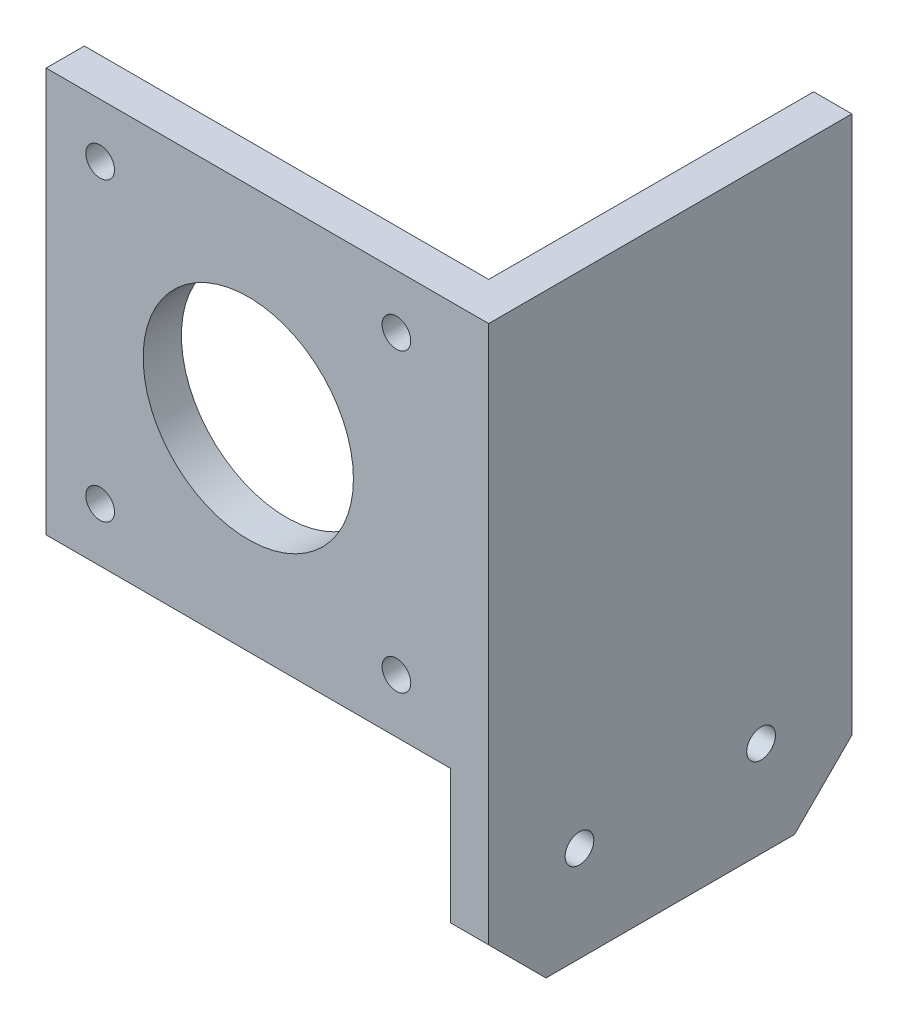
ISO-10303-21;
HEADER;
FILE_DESCRIPTION(('STEP AP214'),'2;1');
FILE_NAME('part.step','',(''),(''),'','','');
FILE_SCHEMA(('AUTOMOTIVE_DESIGN { 1 0 10303 214 1 1 1 1 }'));
ENDSEC;
DATA;
#1=APPLICATION_CONTEXT('core data for automotive mechanical design processes');
#2=APPLICATION_PROTOCOL_DEFINITION('international standard','automotive_design',2000,#1);
#3=PRODUCT_CONTEXT('',#1,'mechanical');
#4=PRODUCT('Part','Part','',(#3));
#5=PRODUCT_RELATED_PRODUCT_CATEGORY('part','',(#4));
#6=PRODUCT_DEFINITION_FORMATION('','',#4);
#7=PRODUCT_DEFINITION_CONTEXT('part definition',#1,'design');
#8=PRODUCT_DEFINITION('design','',#6,#7);
#9=PRODUCT_DEFINITION_SHAPE('','',#8);
#10=(LENGTH_UNIT() NAMED_UNIT(*) SI_UNIT(.MILLI.,.METRE.));
#11=(NAMED_UNIT(*) PLANE_ANGLE_UNIT() SI_UNIT($,.RADIAN.));
#12=(NAMED_UNIT(*) SI_UNIT($,.STERADIAN.) SOLID_ANGLE_UNIT());
#13=UNCERTAINTY_MEASURE_WITH_UNIT(LENGTH_MEASURE(1.E-05),#10,'distance_accuracy_value','');
#14=(GEOMETRIC_REPRESENTATION_CONTEXT(3) GLOBAL_UNCERTAINTY_ASSIGNED_CONTEXT((#13)) GLOBAL_UNIT_ASSIGNED_CONTEXT((#10,
#11,#12)) REPRESENTATION_CONTEXT('',''));
#15=CARTESIAN_POINT('',(0.,0.,0.));
#16=DIRECTION('',(0.,0.,1.));
#17=DIRECTION('',(1.,0.,0.));
#18=AXIS2_PLACEMENT_3D('',#15,#16,#17);
#19=CARTESIAN_POINT('',(0.,0.,4.));
#20=DIRECTION('',(0.,0.,-1.));
#21=DIRECTION('',(-1.,0.,0.));
#22=AXIS2_PLACEMENT_3D('',#19,#20,#21);
#23=PLANE('',#22);
#24=DIRECTION('',(0.,-1.,0.));
#25=VECTOR('',#24,1.);
#26=CARTESIAN_POINT('',(21.15,21.15,4.));
#27=LINE('',#26,#25);
#28=CARTESIAN_POINT('',(21.15,-21.15,4.));
#29=VERTEX_POINT('',#28);
#30=CARTESIAN_POINT('',(21.15,-35.15,3.99999999999999));
#31=VERTEX_POINT('',#30);
#32=EDGE_CURVE('E134',#29,#31,#27,.T.);
#33=ORIENTED_EDGE('',*,*,#32,.T.);
#34=DIRECTION('',(1.,0.,0.));
#35=VECTOR('',#34,1.);
#36=CARTESIAN_POINT('',(0.,-35.15,4.));
#37=LINE('',#36,#35);
#38=CARTESIAN_POINT('',(25.15,-35.15,3.99999999999999));
#39=VERTEX_POINT('',#38);
#40=EDGE_CURVE('E11',#31,#39,#37,.T.);
#41=ORIENTED_EDGE('',*,*,#40,.T.);
#42=DIRECTION('',(0.,-1.,0.));
#43=VECTOR('',#42,1.);
#44=CARTESIAN_POINT('',(25.15,21.15,4.));
#45=LINE('',#44,#43);
#46=CARTESIAN_POINT('',(25.15,21.15,4.));
#47=VERTEX_POINT('',#46);
#48=EDGE_CURVE('E141',#47,#39,#45,.T.);
#49=ORIENTED_EDGE('',*,*,#48,.F.);
#50=DIRECTION('',(-1.,0.,0.));
#51=VECTOR('',#50,1.);
#52=CARTESIAN_POINT('',(-21.15,21.15,4.));
#53=LINE('',#52,#51);
#54=CARTESIAN_POINT('',(-21.15,21.15,4.));
#55=VERTEX_POINT('',#54);
#56=EDGE_CURVE('E130',#47,#55,#53,.T.);
#57=ORIENTED_EDGE('',*,*,#56,.T.);
#58=DIRECTION('',(0.,-1.,0.));
#59=VECTOR('',#58,1.);
#60=CARTESIAN_POINT('',(-21.15,-21.15,4.));
#61=LINE('',#60,#59);
#62=CARTESIAN_POINT('',(-21.15,-21.15,4.));
#63=VERTEX_POINT('',#62);
#64=EDGE_CURVE('E174',#55,#63,#61,.T.);
#65=ORIENTED_EDGE('',*,*,#64,.T.);
#66=DIRECTION('',(1.,0.,0.));
#67=VECTOR('',#66,1.);
#68=CARTESIAN_POINT('',(-21.15,-21.15,4.));
#69=LINE('',#68,#67);
#70=EDGE_CURVE('E177',#63,#29,#69,.T.);
#71=ORIENTED_EDGE('',*,*,#70,.T.);
#72=EDGE_LOOP('',(#33,#41,#49,#57,#65,#71));
#73=FACE_BOUND('',#72,.T.);
#74=CARTESIAN_POINT('',(0.,0.,4.));
#75=DIRECTION('',(0.,0.,1.));
#76=DIRECTION('',(1.,0.,0.));
#77=AXIS2_PLACEMENT_3D('',#74,#75,#76);
#78=CIRCLE('',#77,11.);
#79=CARTESIAN_POINT('',(11.,0.,4.));
#80=VERTEX_POINT('',#79);
#81=EDGE_CURVE('E167',#80,#80,#78,.T.);
#82=ORIENTED_EDGE('',*,*,#81,.F.);
#83=EDGE_LOOP('',(#82));
#84=FACE_BOUND('',#83,.T.);
#85=CARTESIAN_POINT('',(-15.5,15.5,4.));
#86=DIRECTION('',(0.,0.,1.));
#87=DIRECTION('',(1.,0.,0.));
#88=AXIS2_PLACEMENT_3D('',#85,#86,#87);
#89=CIRCLE('',#88,1.5);
#90=CARTESIAN_POINT('',(-14.,15.5,4.));
#91=VERTEX_POINT('',#90);
#92=EDGE_CURVE('E161',#91,#91,#89,.T.);
#93=ORIENTED_EDGE('',*,*,#92,.F.);
#94=EDGE_LOOP('',(#93));
#95=FACE_BOUND('',#94,.T.);
#96=CARTESIAN_POINT('',(15.5,15.5,4.));
#97=DIRECTION('',(0.,0.,1.));
#98=DIRECTION('',(-1.,0.,0.));
#99=AXIS2_PLACEMENT_3D('',#96,#97,#98);
#100=CIRCLE('',#99,1.5);
#101=CARTESIAN_POINT('',(14.,15.5,4.));
#102=VERTEX_POINT('',#101);
#103=EDGE_CURVE('E155',#102,#102,#100,.T.);
#104=ORIENTED_EDGE('',*,*,#103,.F.);
#105=EDGE_LOOP('',(#104));
#106=FACE_BOUND('',#105,.T.);
#107=CARTESIAN_POINT('',(15.5,-15.5,4.));
#108=DIRECTION('',(0.,0.,1.));
#109=DIRECTION('',(1.,0.,0.));
#110=AXIS2_PLACEMENT_3D('',#107,#108,#109);
#111=CIRCLE('',#110,1.5);
#112=CARTESIAN_POINT('',(17.,-15.5,4.));
#113=VERTEX_POINT('',#112);
#114=EDGE_CURVE('E149',#113,#113,#111,.T.);
#115=ORIENTED_EDGE('',*,*,#114,.F.);
#116=EDGE_LOOP('',(#115));
#117=FACE_BOUND('',#116,.T.);
#118=CARTESIAN_POINT('',(-15.5,-15.5,4.));
#119=DIRECTION('',(0.,0.,1.));
#120=DIRECTION('',(-1.,0.,0.));
#121=AXIS2_PLACEMENT_3D('',#118,#119,#120);
#122=CIRCLE('',#121,1.5);
#123=CARTESIAN_POINT('',(-17.,-15.5,4.));
#124=VERTEX_POINT('',#123);
#125=EDGE_CURVE('E143',#124,#124,#122,.T.);
#126=ORIENTED_EDGE('',*,*,#125,.F.);
#127=EDGE_LOOP('',(#126));
#128=FACE_BOUND('',#127,.T.);
#129=ADVANCED_FACE('F33',(#73,#84,#95,#106,#117,#128),#23,.F.);
#130=CARTESIAN_POINT('',(0.,0.,0.));
#131=DIRECTION('',(0.,0.,-1.));
#132=DIRECTION('',(-1.,0.,0.));
#133=AXIS2_PLACEMENT_3D('',#130,#131,#132);
#134=PLANE('',#133);
#135=CARTESIAN_POINT('',(15.5,-15.5,0.));
#136=DIRECTION('',(0.,0.,1.));
#137=DIRECTION('',(1.,0.,0.));
#138=AXIS2_PLACEMENT_3D('',#135,#136,#137);
#139=CIRCLE('',#138,1.5);
#140=CARTESIAN_POINT('',(17.,-15.5,0.));
#141=VERTEX_POINT('',#140);
#142=EDGE_CURVE('E146',#141,#141,#139,.T.);
#143=ORIENTED_EDGE('',*,*,#142,.T.);
#144=EDGE_LOOP('',(#143));
#145=FACE_BOUND('',#144,.T.);
#146=CARTESIAN_POINT('',(-15.5,15.5,0.));
#147=DIRECTION('',(0.,0.,1.));
#148=DIRECTION('',(1.,0.,0.));
#149=AXIS2_PLACEMENT_3D('',#146,#147,#148);
#150=CIRCLE('',#149,1.5);
#151=CARTESIAN_POINT('',(-14.,15.5,0.));
#152=VERTEX_POINT('',#151);
#153=EDGE_CURVE('E158',#152,#152,#150,.T.);
#154=ORIENTED_EDGE('',*,*,#153,.T.);
#155=EDGE_LOOP('',(#154));
#156=FACE_BOUND('',#155,.T.);
#157=DIRECTION('',(0.,1.,0.));
#158=VECTOR('',#157,1.);
#159=CARTESIAN_POINT('',(21.15,-21.15,0.));
#160=LINE('',#159,#158);
#161=CARTESIAN_POINT('',(21.15,-21.15,0.));
#162=VERTEX_POINT('',#161);
#163=CARTESIAN_POINT('',(21.15,21.15,0.));
#164=VERTEX_POINT('',#163);
#165=EDGE_CURVE('E170',#162,#164,#160,.T.);
#166=ORIENTED_EDGE('',*,*,#165,.F.);
#167=DIRECTION('',(1.,0.,0.));
#168=VECTOR('',#167,1.);
#169=CARTESIAN_POINT('',(-21.15,-21.15,0.));
#170=LINE('',#169,#168);
#171=CARTESIAN_POINT('',(-21.15,-21.15,0.));
#172=VERTEX_POINT('',#171);
#173=EDGE_CURVE('E175',#172,#162,#170,.T.);
#174=ORIENTED_EDGE('',*,*,#173,.F.);
#175=DIRECTION('',(0.,-1.,0.));
#176=VECTOR('',#175,1.);
#177=CARTESIAN_POINT('',(-21.15,-21.15,0.));
#178=LINE('',#177,#176);
#179=CARTESIAN_POINT('',(-21.15,21.15,0.));
#180=VERTEX_POINT('',#179);
#181=EDGE_CURVE('E184',#180,#172,#178,.T.);
#182=ORIENTED_EDGE('',*,*,#181,.F.);
#183=DIRECTION('',(-1.,0.,0.));
#184=VECTOR('',#183,1.);
#185=CARTESIAN_POINT('',(-21.15,21.15,0.));
#186=LINE('',#185,#184);
#187=EDGE_CURVE('E182',#164,#180,#186,.T.);
#188=ORIENTED_EDGE('',*,*,#187,.F.);
#189=EDGE_LOOP('',(#166,#174,#182,#188));
#190=FACE_BOUND('',#189,.T.);
#191=CARTESIAN_POINT('',(0.,0.,0.));
#192=DIRECTION('',(0.,0.,1.));
#193=DIRECTION('',(1.,0.,0.));
#194=AXIS2_PLACEMENT_3D('',#191,#192,#193);
#195=CIRCLE('',#194,11.);
#196=CARTESIAN_POINT('',(11.,0.,0.));
#197=VERTEX_POINT('',#196);
#198=EDGE_CURVE('E164',#197,#197,#195,.T.);
#199=ORIENTED_EDGE('',*,*,#198,.T.);
#200=EDGE_LOOP('',(#199));
#201=FACE_BOUND('',#200,.T.);
#202=CARTESIAN_POINT('',(15.5,15.5,0.));
#203=DIRECTION('',(0.,0.,1.));
#204=DIRECTION('',(-1.,0.,0.));
#205=AXIS2_PLACEMENT_3D('',#202,#203,#204);
#206=CIRCLE('',#205,1.5);
#207=CARTESIAN_POINT('',(14.,15.5,0.));
#208=VERTEX_POINT('',#207);
#209=EDGE_CURVE('E152',#208,#208,#206,.T.);
#210=ORIENTED_EDGE('',*,*,#209,.T.);
#211=EDGE_LOOP('',(#210));
#212=FACE_BOUND('',#211,.T.);
#213=CARTESIAN_POINT('',(-15.5,-15.5,0.));
#214=DIRECTION('',(0.,0.,1.));
#215=DIRECTION('',(-1.,0.,0.));
#216=AXIS2_PLACEMENT_3D('',#213,#214,#215);
#217=CIRCLE('',#216,1.5);
#218=CARTESIAN_POINT('',(-17.,-15.5,0.));
#219=VERTEX_POINT('',#218);
#220=EDGE_CURVE('E126',#219,#219,#217,.T.);
#221=ORIENTED_EDGE('',*,*,#220,.T.);
#222=EDGE_LOOP('',(#221));
#223=FACE_BOUND('',#222,.T.);
#224=ADVANCED_FACE('F227',(#145,#156,#190,#201,#212,#223),#134,.T.);
#225=CARTESIAN_POINT('',(-21.15,21.15,4.));
#226=DIRECTION('',(0.,-1.,0.));
#227=DIRECTION('',(0.,0.,-1.));
#228=AXIS2_PLACEMENT_3D('',#225,#226,#227);
#229=PLANE('',#228);
#230=ORIENTED_EDGE('',*,*,#187,.T.);
#231=DIRECTION('',(0.,0.,-1.));
#232=VECTOR('',#231,1.);
#233=CARTESIAN_POINT('',(-21.15,21.15,4.));
#234=LINE('',#233,#232);
#235=EDGE_CURVE('E193',#55,#180,#234,.T.);
#236=ORIENTED_EDGE('',*,*,#235,.F.);
#237=ORIENTED_EDGE('',*,*,#56,.F.);
#238=DIRECTION('',(0.,0.,1.));
#239=VECTOR('',#238,1.);
#240=CARTESIAN_POINT('',(25.15,21.15,4.));
#241=LINE('',#240,#239);
#242=CARTESIAN_POINT('',(25.15,21.15,-34.));
#243=VERTEX_POINT('',#242);
#244=EDGE_CURVE('E111',#243,#47,#241,.T.);
#245=ORIENTED_EDGE('',*,*,#244,.F.);
#246=DIRECTION('',(-1.,0.,0.));
#247=VECTOR('',#246,1.);
#248=CARTESIAN_POINT('',(25.15,21.15,-34.));
#249=LINE('',#248,#247);
#250=CARTESIAN_POINT('',(21.15,21.15,-34.));
#251=VERTEX_POINT('',#250);
#252=EDGE_CURVE('E119',#243,#251,#249,.T.);
#253=ORIENTED_EDGE('',*,*,#252,.T.);
#254=DIRECTION('',(0.,0.,1.));
#255=VECTOR('',#254,1.);
#256=CARTESIAN_POINT('',(21.15,21.15,4.));
#257=LINE('',#256,#255);
#258=EDGE_CURVE('E140',#251,#164,#257,.T.);
#259=ORIENTED_EDGE('',*,*,#258,.T.);
#260=EDGE_LOOP('',(#230,#236,#237,#245,#253,#259));
#261=FACE_BOUND('',#260,.T.);
#262=ADVANCED_FACE('F128',(#261),#229,.F.);
#263=CARTESIAN_POINT('',(-21.15,-21.15,4.));
#264=DIRECTION('',(1.,0.,0.));
#265=DIRECTION('',(0.,0.,-1.));
#266=AXIS2_PLACEMENT_3D('',#263,#264,#265);
#267=PLANE('',#266);
#268=ORIENTED_EDGE('',*,*,#181,.T.);
#269=DIRECTION('',(0.,0.,-1.));
#270=VECTOR('',#269,1.);
#271=CARTESIAN_POINT('',(-21.15,-21.15,4.));
#272=LINE('',#271,#270);
#273=EDGE_CURVE('E190',#63,#172,#272,.T.);
#274=ORIENTED_EDGE('',*,*,#273,.F.);
#275=ORIENTED_EDGE('',*,*,#64,.F.);
#276=ORIENTED_EDGE('',*,*,#235,.T.);
#277=EDGE_LOOP('',(#268,#274,#275,#276));
#278=FACE_BOUND('',#277,.T.);
#279=ADVANCED_FACE('F226',(#278),#267,.F.);
#280=CARTESIAN_POINT('',(-21.15,-21.15,4.));
#281=DIRECTION('',(0.,1.,0.));
#282=DIRECTION('',(0.,0.,1.));
#283=AXIS2_PLACEMENT_3D('',#280,#281,#282);
#284=PLANE('',#283);
#285=ORIENTED_EDGE('',*,*,#173,.T.);
#286=DIRECTION('',(0.,0.,-1.));
#287=VECTOR('',#286,1.);
#288=CARTESIAN_POINT('',(21.15,-21.15,4.));
#289=LINE('',#288,#287);
#290=EDGE_CURVE('E179',#29,#162,#289,.T.);
#291=ORIENTED_EDGE('',*,*,#290,.F.);
#292=ORIENTED_EDGE('',*,*,#70,.F.);
#293=ORIENTED_EDGE('',*,*,#273,.T.);
#294=EDGE_LOOP('',(#285,#291,#292,#293));
#295=FACE_BOUND('',#294,.T.);
#296=ADVANCED_FACE('F221',(#295),#284,.F.);
#297=CARTESIAN_POINT('',(0.,0.,4.));
#298=DIRECTION('',(0.,0.,-1.));
#299=DIRECTION('',(-1.,0.,0.));
#300=AXIS2_PLACEMENT_3D('',#297,#298,#299);
#301=CYLINDRICAL_SURFACE('',#300,11.);
#302=ORIENTED_EDGE('',*,*,#81,.T.);
#303=EDGE_LOOP('',(#302));
#304=FACE_BOUND('',#303,.T.);
#305=ORIENTED_EDGE('',*,*,#198,.F.);
#306=EDGE_LOOP('',(#305));
#307=FACE_BOUND('',#306,.T.);
#308=ADVANCED_FACE('F258',(#304,#307),#301,.F.);
#309=CARTESIAN_POINT('',(-15.5,15.5,4.));
#310=DIRECTION('',(0.,0.,-1.));
#311=DIRECTION('',(-1.,0.,0.));
#312=AXIS2_PLACEMENT_3D('',#309,#310,#311);
#313=CYLINDRICAL_SURFACE('',#312,1.5);
#314=ORIENTED_EDGE('',*,*,#92,.T.);
#315=EDGE_LOOP('',(#314));
#316=FACE_BOUND('',#315,.T.);
#317=ORIENTED_EDGE('',*,*,#153,.F.);
#318=EDGE_LOOP('',(#317));
#319=FACE_BOUND('',#318,.T.);
#320=ADVANCED_FACE('F364',(#316,#319),#313,.F.);
#321=CARTESIAN_POINT('',(15.5,15.5,4.));
#322=DIRECTION('',(0.,0.,-1.));
#323=DIRECTION('',(-1.,0.,0.));
#324=AXIS2_PLACEMENT_3D('',#321,#322,#323);
#325=CYLINDRICAL_SURFACE('',#324,1.5);
#326=ORIENTED_EDGE('',*,*,#103,.T.);
#327=EDGE_LOOP('',(#326));
#328=FACE_BOUND('',#327,.T.);
#329=ORIENTED_EDGE('',*,*,#209,.F.);
#330=EDGE_LOOP('',(#329));
#331=FACE_BOUND('',#330,.T.);
#332=ADVANCED_FACE('F249',(#328,#331),#325,.F.);
#333=CARTESIAN_POINT('',(15.5,-15.5,4.));
#334=DIRECTION('',(0.,0.,-1.));
#335=DIRECTION('',(-1.,0.,0.));
#336=AXIS2_PLACEMENT_3D('',#333,#334,#335);
#337=CYLINDRICAL_SURFACE('',#336,1.5);
#338=ORIENTED_EDGE('',*,*,#114,.T.);
#339=EDGE_LOOP('',(#338));
#340=FACE_BOUND('',#339,.T.);
#341=ORIENTED_EDGE('',*,*,#142,.F.);
#342=EDGE_LOOP('',(#341));
#343=FACE_BOUND('',#342,.T.);
#344=ADVANCED_FACE('F240',(#340,#343),#337,.F.);
#345=CARTESIAN_POINT('',(-15.5,-15.5,4.));
#346=DIRECTION('',(0.,0.,-1.));
#347=DIRECTION('',(-1.,0.,0.));
#348=AXIS2_PLACEMENT_3D('',#345,#346,#347);
#349=CYLINDRICAL_SURFACE('',#348,1.5);
#350=ORIENTED_EDGE('',*,*,#125,.T.);
#351=EDGE_LOOP('',(#350));
#352=FACE_BOUND('',#351,.T.);
#353=ORIENTED_EDGE('',*,*,#220,.F.);
#354=EDGE_LOOP('',(#353));
#355=FACE_BOUND('',#354,.T.);
#356=ADVANCED_FACE('F238',(#352,#355),#349,.F.);
#357=CARTESIAN_POINT('',(21.15,0.,0.));
#358=DIRECTION('',(1.,0.,0.));
#359=DIRECTION('',(0.,0.,-1.));
#360=AXIS2_PLACEMENT_3D('',#357,#358,#359);
#361=PLANE('',#360);
#362=CARTESIAN_POINT('',(21.15,-31.15,-5.5));
#363=DIRECTION('',(1.,0.,0.));
#364=DIRECTION('',(0.,0.,-1.));
#365=AXIS2_PLACEMENT_3D('',#362,#363,#364);
#366=CIRCLE('',#365,1.5);
#367=CARTESIAN_POINT('',(21.15,-31.15,-7.));
#368=VERTEX_POINT('',#367);
#369=EDGE_CURVE('E422',#368,#368,#366,.T.);
#370=ORIENTED_EDGE('',*,*,#369,.T.);
#371=EDGE_LOOP('',(#370));
#372=FACE_BOUND('',#371,.T.);
#373=CARTESIAN_POINT('',(21.15,-31.15,-24.5));
#374=DIRECTION('',(1.,0.,0.));
#375=DIRECTION('',(0.,0.,1.));
#376=AXIS2_PLACEMENT_3D('',#373,#374,#375);
#377=CIRCLE('',#376,1.5);
#378=CARTESIAN_POINT('',(21.15,-31.15,-23.));
#379=VERTEX_POINT('',#378);
#380=EDGE_CURVE('E428',#379,#379,#377,.T.);
#381=ORIENTED_EDGE('',*,*,#380,.T.);
#382=EDGE_LOOP('',(#381));
#383=FACE_BOUND('',#382,.T.);
#384=DIRECTION('',(0.,1.,0.));
#385=VECTOR('',#384,1.);
#386=CARTESIAN_POINT('',(21.15,21.15,-34.));
#387=LINE('',#386,#385);
#388=CARTESIAN_POINT('',(21.15,-35.15,-34.));
#389=VERTEX_POINT('',#388);
#390=EDGE_CURVE('E122',#389,#251,#387,.T.);
#391=ORIENTED_EDGE('',*,*,#390,.F.);
#392=DIRECTION('',(0.,0.707106781186546,-0.707106781186549));
#393=VECTOR('',#392,1.);
#394=CARTESIAN_POINT('',(21.15,-35.15,-34.));
#395=LINE('',#394,#393);
#396=CARTESIAN_POINT('',(21.15,-41.15,-28.));
#397=VERTEX_POINT('',#396);
#398=EDGE_CURVE('E200',#389,#397,#395,.F.);
#399=ORIENTED_EDGE('',*,*,#398,.T.);
#400=DIRECTION('',(0.,0.,-1.));
#401=VECTOR('',#400,1.);
#402=CARTESIAN_POINT('',(21.15,-41.15,3.99999999999999));
#403=LINE('',#402,#401);
#404=CARTESIAN_POINT('',(21.15,-41.15,-2.00000000000001));
#405=VERTEX_POINT('',#404);
#406=EDGE_CURVE('E136',#405,#397,#403,.T.);
#407=ORIENTED_EDGE('',*,*,#406,.F.);
#408=DIRECTION('',(0.,-0.707106781186549,-0.707106781186546));
#409=VECTOR('',#408,1.);
#410=CARTESIAN_POINT('',(21.15,-41.15,-2.00000000000001));
#411=LINE('',#410,#409);
#412=EDGE_CURVE('E198',#405,#31,#411,.F.);
#413=ORIENTED_EDGE('',*,*,#412,.T.);
#414=ORIENTED_EDGE('',*,*,#32,.F.);
#415=ORIENTED_EDGE('',*,*,#290,.T.);
#416=ORIENTED_EDGE('',*,*,#165,.T.);
#417=ORIENTED_EDGE('',*,*,#258,.F.);
#418=EDGE_LOOP('',(#391,#399,#407,#413,#414,#415,#416,#417));
#419=FACE_BOUND('',#418,.T.);
#420=ADVANCED_FACE('F214',(#372,#383,#419),#361,.F.);
#421=CARTESIAN_POINT('',(25.15,0.,0.));
#422=DIRECTION('',(1.,0.,0.));
#423=DIRECTION('',(0.,0.,-1.));
#424=AXIS2_PLACEMENT_3D('',#421,#422,#423);
#425=PLANE('',#424);
#426=CARTESIAN_POINT('',(25.15,-31.15,-5.5));
#427=DIRECTION('',(1.,0.,0.));
#428=DIRECTION('',(0.,0.,-1.));
#429=AXIS2_PLACEMENT_3D('',#426,#427,#428);
#430=CIRCLE('',#429,1.5);
#431=CARTESIAN_POINT('',(25.15,-31.15,-7.));
#432=VERTEX_POINT('',#431);
#433=EDGE_CURVE('E137',#432,#432,#430,.T.);
#434=ORIENTED_EDGE('',*,*,#433,.F.);
#435=EDGE_LOOP('',(#434));
#436=FACE_BOUND('',#435,.T.);
#437=DIRECTION('',(0.,0.,-1.));
#438=VECTOR('',#437,1.);
#439=CARTESIAN_POINT('',(25.15,-41.15,3.99999999999999));
#440=LINE('',#439,#438);
#441=CARTESIAN_POINT('',(25.15,-41.15,-2.00000000000001));
#442=VERTEX_POINT('',#441);
#443=CARTESIAN_POINT('',(25.15,-41.15,-28.));
#444=VERTEX_POINT('',#443);
#445=EDGE_CURVE('E116',#442,#444,#440,.T.);
#446=ORIENTED_EDGE('',*,*,#445,.T.);
#447=DIRECTION('',(0.,-0.707106781186546,0.707106781186549));
#448=VECTOR('',#447,1.);
#449=CARTESIAN_POINT('',(25.15,-34.5750000000001,-34.5749999999999));
#450=LINE('',#449,#448);
#451=CARTESIAN_POINT('',(25.15,-35.15,-34.));
#452=VERTEX_POINT('',#451);
#453=EDGE_CURVE('E41',#444,#452,#450,.F.);
#454=ORIENTED_EDGE('',*,*,#453,.T.);
#455=DIRECTION('',(0.,1.,0.));
#456=VECTOR('',#455,1.);
#457=CARTESIAN_POINT('',(25.15,21.15,-34.));
#458=LINE('',#457,#456);
#459=EDGE_CURVE('E106',#452,#243,#458,.T.);
#460=ORIENTED_EDGE('',*,*,#459,.T.);
#461=ORIENTED_EDGE('',*,*,#244,.T.);
#462=ORIENTED_EDGE('',*,*,#48,.T.);
#463=DIRECTION('',(0.,0.707106781186549,0.707106781186546));
#464=VECTOR('',#463,1.);
#465=CARTESIAN_POINT('',(25.15,-19.5749999999999,19.575));
#466=LINE('',#465,#464);
#467=EDGE_CURVE('E206',#39,#442,#466,.F.);
#468=ORIENTED_EDGE('',*,*,#467,.T.);
#469=EDGE_LOOP('',(#446,#454,#460,#461,#462,#468));
#470=FACE_BOUND('',#469,.T.);
#471=CARTESIAN_POINT('',(25.15,-31.15,-24.5));
#472=DIRECTION('',(1.,0.,0.));
#473=DIRECTION('',(0.,0.,1.));
#474=AXIS2_PLACEMENT_3D('',#471,#472,#473);
#475=CIRCLE('',#474,1.5);
#476=CARTESIAN_POINT('',(25.15,-31.15,-23.));
#477=VERTEX_POINT('',#476);
#478=EDGE_CURVE('E425',#477,#477,#475,.T.);
#479=ORIENTED_EDGE('',*,*,#478,.F.);
#480=EDGE_LOOP('',(#479));
#481=FACE_BOUND('',#480,.T.);
#482=ADVANCED_FACE('F108',(#436,#470,#481),#425,.T.);
#483=CARTESIAN_POINT('',(25.15,-41.15,3.99999999999999));
#484=DIRECTION('',(0.,1.,0.));
#485=DIRECTION('',(0.,0.,1.));
#486=AXIS2_PLACEMENT_3D('',#483,#484,#485);
#487=PLANE('',#486);
#488=ORIENTED_EDGE('',*,*,#406,.T.);
#489=DIRECTION('',(1.,0.,0.));
#490=VECTOR('',#489,1.);
#491=CARTESIAN_POINT('',(25.15,-41.15,-28.));
#492=LINE('',#491,#490);
#493=EDGE_CURVE('E54',#397,#444,#492,.T.);
#494=ORIENTED_EDGE('',*,*,#493,.T.);
#495=ORIENTED_EDGE('',*,*,#445,.F.);
#496=DIRECTION('',(-1.,0.,0.));
#497=VECTOR('',#496,1.);
#498=CARTESIAN_POINT('',(25.15,-41.15,-2.00000000000001));
#499=LINE('',#498,#497);
#500=EDGE_CURVE('E202',#442,#405,#499,.T.);
#501=ORIENTED_EDGE('',*,*,#500,.T.);
#502=EDGE_LOOP('',(#488,#494,#495,#501));
#503=FACE_BOUND('',#502,.T.);
#504=ADVANCED_FACE('F210',(#503),#487,.F.);
#505=CARTESIAN_POINT('',(25.15,21.15,-34.));
#506=DIRECTION('',(0.,0.,1.));
#507=DIRECTION('',(0.,-1.,0.));
#508=AXIS2_PLACEMENT_3D('',#505,#506,#507);
#509=PLANE('',#508);
#510=ORIENTED_EDGE('',*,*,#459,.F.);
#511=DIRECTION('',(-1.,0.,0.));
#512=VECTOR('',#511,1.);
#513=CARTESIAN_POINT('',(25.15,-35.15,-34.));
#514=LINE('',#513,#512);
#515=EDGE_CURVE('E196',#452,#389,#514,.T.);
#516=ORIENTED_EDGE('',*,*,#515,.T.);
#517=ORIENTED_EDGE('',*,*,#390,.T.);
#518=ORIENTED_EDGE('',*,*,#252,.F.);
#519=EDGE_LOOP('',(#510,#516,#517,#518));
#520=FACE_BOUND('',#519,.T.);
#521=ADVANCED_FACE('F120',(#520),#509,.F.);
#522=CARTESIAN_POINT('',(25.15,-31.15,-5.5));
#523=DIRECTION('',(-1.,0.,0.));
#524=DIRECTION('',(0.,0.,1.));
#525=AXIS2_PLACEMENT_3D('',#522,#523,#524);
#526=CYLINDRICAL_SURFACE('',#525,1.5);
#527=ORIENTED_EDGE('',*,*,#433,.T.);
#528=EDGE_LOOP('',(#527));
#529=FACE_BOUND('',#528,.T.);
#530=ORIENTED_EDGE('',*,*,#369,.F.);
#531=EDGE_LOOP('',(#530));
#532=FACE_BOUND('',#531,.T.);
#533=ADVANCED_FACE('F274',(#529,#532),#526,.F.);
#534=CARTESIAN_POINT('',(25.15,-31.15,-24.5));
#535=DIRECTION('',(-1.,0.,0.));
#536=DIRECTION('',(0.,0.,1.));
#537=AXIS2_PLACEMENT_3D('',#534,#535,#536);
#538=CYLINDRICAL_SURFACE('',#537,1.5);
#539=ORIENTED_EDGE('',*,*,#478,.T.);
#540=EDGE_LOOP('',(#539));
#541=FACE_BOUND('',#540,.T.);
#542=ORIENTED_EDGE('',*,*,#380,.F.);
#543=EDGE_LOOP('',(#542));
#544=FACE_BOUND('',#543,.T.);
#545=ADVANCED_FACE('F268',(#541,#544),#538,.F.);
#546=CARTESIAN_POINT('',(25.15,-35.15,-34.));
#547=DIRECTION('',(0.,0.707106781186549,0.707106781186546));
#548=DIRECTION('',(-1.,0.,0.));
#549=AXIS2_PLACEMENT_3D('',#546,#547,#548);
#550=PLANE('',#549);
#551=ORIENTED_EDGE('',*,*,#453,.F.);
#552=ORIENTED_EDGE('',*,*,#493,.F.);
#553=ORIENTED_EDGE('',*,*,#398,.F.);
#554=ORIENTED_EDGE('',*,*,#515,.F.);
#555=EDGE_LOOP('',(#551,#552,#553,#554));
#556=FACE_BOUND('',#555,.T.);
#557=ADVANCED_FACE('F266',(#556),#550,.F.);
#558=CARTESIAN_POINT('',(25.15,-41.15,-2.00000000000001));
#559=DIRECTION('',(0.,0.707106781186546,-0.707106781186549));
#560=DIRECTION('',(-1.,0.,0.));
#561=AXIS2_PLACEMENT_3D('',#558,#559,#560);
#562=PLANE('',#561);
#563=ORIENTED_EDGE('',*,*,#467,.F.);
#564=ORIENTED_EDGE('',*,*,#40,.F.);
#565=ORIENTED_EDGE('',*,*,#412,.F.);
#566=ORIENTED_EDGE('',*,*,#500,.F.);
#567=EDGE_LOOP('',(#563,#564,#565,#566));
#568=FACE_BOUND('',#567,.T.);
#569=ADVANCED_FACE('F35',(#568),#562,.F.);
#570=CLOSED_SHELL('',(#129,#224,#262,#279,#296,#308,#320,#332,#344,#356,#420,#482,#504,#521,
#533,#545,#557,#569));
#571=MANIFOLD_SOLID_BREP('B2',#570);
#572=ADVANCED_BREP_SHAPE_REPRESENTATION('',(#18,#571),#14);
#573=SHAPE_DEFINITION_REPRESENTATION(#9,#572);
ENDSEC;
END-ISO-10303-21;
